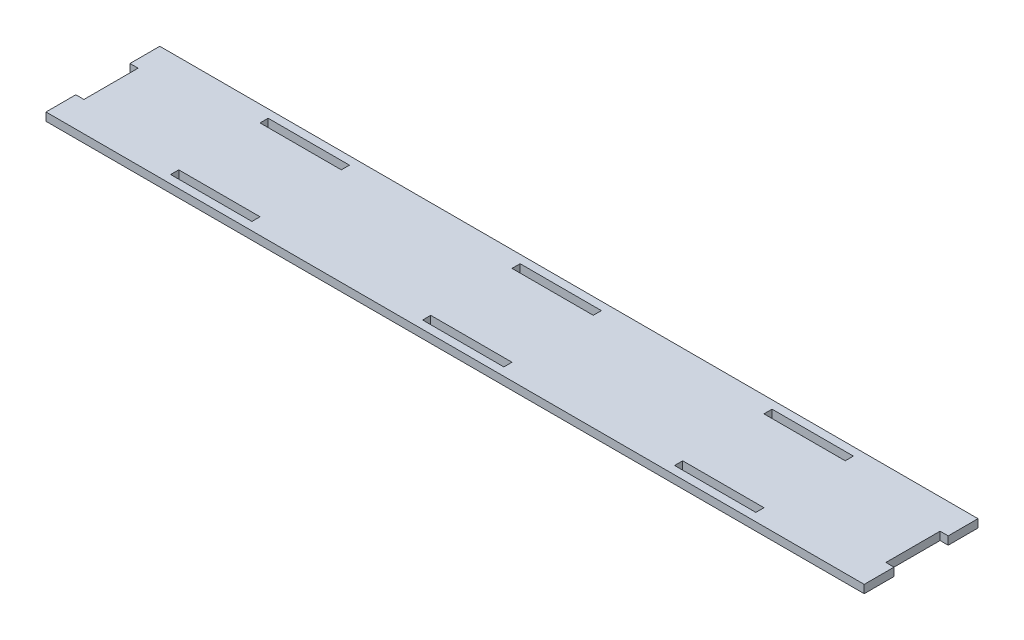
ISO-10303-21;
HEADER;
FILE_DESCRIPTION(('STEP AP214'),'2;1');
FILE_NAME('part.step','',(''),(''),'','','');
FILE_SCHEMA(('AUTOMOTIVE_DESIGN { 1 0 10303 214 1 1 1 1 }'));
ENDSEC;
DATA;
#1=APPLICATION_CONTEXT('core data for automotive mechanical design processes');
#2=APPLICATION_PROTOCOL_DEFINITION('international standard','automotive_design',2000,#1);
#3=PRODUCT_CONTEXT('',#1,'mechanical');
#4=PRODUCT('Part','Part','',(#3));
#5=PRODUCT_RELATED_PRODUCT_CATEGORY('part','',(#4));
#6=PRODUCT_DEFINITION_FORMATION('','',#4);
#7=PRODUCT_DEFINITION_CONTEXT('part definition',#1,'design');
#8=PRODUCT_DEFINITION('design','',#6,#7);
#9=PRODUCT_DEFINITION_SHAPE('','',#8);
#10=(LENGTH_UNIT() NAMED_UNIT(*) SI_UNIT(.MILLI.,.METRE.));
#11=(NAMED_UNIT(*) PLANE_ANGLE_UNIT() SI_UNIT($,.RADIAN.));
#12=(NAMED_UNIT(*) SI_UNIT($,.STERADIAN.) SOLID_ANGLE_UNIT());
#13=UNCERTAINTY_MEASURE_WITH_UNIT(LENGTH_MEASURE(1.E-05),#10,'distance_accuracy_value','');
#14=(GEOMETRIC_REPRESENTATION_CONTEXT(3) GLOBAL_UNCERTAINTY_ASSIGNED_CONTEXT((#13)) GLOBAL_UNIT_ASSIGNED_CONTEXT((#10,
#11,#12)) REPRESENTATION_CONTEXT('',''));
#15=CARTESIAN_POINT('',(0.,0.,0.));
#16=DIRECTION('',(0.,0.,1.));
#17=DIRECTION('',(1.,0.,0.));
#18=AXIS2_PLACEMENT_3D('',#15,#16,#17);
#19=CARTESIAN_POINT('',(0.,3.,0.));
#20=DIRECTION('',(0.,-1.,0.));
#21=DIRECTION('',(0.,0.,-1.));
#22=AXIS2_PLACEMENT_3D('',#19,#20,#21);
#23=PLANE('',#22);
#24=DIRECTION('',(1.,0.,0.));
#25=VECTOR('',#24,1.);
#26=CARTESIAN_POINT('',(136.,3.,-3.00000000000007));
#27=LINE('',#26,#25);
#28=CARTESIAN_POINT('',(136.,3.,-3.00000000000007));
#29=VERTEX_POINT('',#28);
#30=CARTESIAN_POINT('',(166.,3.,-3.00000000000007));
#31=VERTEX_POINT('',#30);
#32=EDGE_CURVE('E302',#29,#31,#27,.T.);
#33=ORIENTED_EDGE('',*,*,#32,.F.);
#34=DIRECTION('',(0.,0.,1.));
#35=VECTOR('',#34,1.);
#36=CARTESIAN_POINT('',(136.,3.,-3.00000000000007));
#37=LINE('',#36,#35);
#38=CARTESIAN_POINT('',(136.,3.,-6.00000000000007));
#39=VERTEX_POINT('',#38);
#40=EDGE_CURVE('E310',#39,#29,#37,.T.);
#41=ORIENTED_EDGE('',*,*,#40,.F.);
#42=DIRECTION('',(-1.,0.,0.));
#43=VECTOR('',#42,1.);
#44=CARTESIAN_POINT('',(136.,3.,-6.00000000000007));
#45=LINE('',#44,#43);
#46=CARTESIAN_POINT('',(166.,3.,-6.00000000000007));
#47=VERTEX_POINT('',#46);
#48=EDGE_CURVE('E307',#47,#39,#45,.T.);
#49=ORIENTED_EDGE('',*,*,#48,.F.);
#50=DIRECTION('',(0.,0.,-1.));
#51=VECTOR('',#50,1.);
#52=CARTESIAN_POINT('',(166.,3.,-3.00000000000007));
#53=LINE('',#52,#51);
#54=EDGE_CURVE('E304',#31,#47,#53,.T.);
#55=ORIENTED_EDGE('',*,*,#54,.F.);
#56=EDGE_LOOP('',(#33,#41,#49,#55));
#57=FACE_BOUND('',#56,.T.);
#58=DIRECTION('',(0.,0.,1.));
#59=VECTOR('',#58,1.);
#60=CARTESIAN_POINT('',(229.,3.,-39.));
#61=LINE('',#60,#59);
#62=CARTESIAN_POINT('',(229.,3.,-39.));
#63=VERTEX_POINT('',#62);
#64=CARTESIAN_POINT('',(229.,3.,-35.9972315914517));
#65=VERTEX_POINT('',#64);
#66=EDGE_CURVE('E364',#63,#65,#61,.T.);
#67=ORIENTED_EDGE('',*,*,#66,.F.);
#68=DIRECTION('',(-1.,0.,0.));
#69=VECTOR('',#68,1.);
#70=CARTESIAN_POINT('',(229.,3.,-39.));
#71=LINE('',#70,#69);
#72=CARTESIAN_POINT('',(259.,3.,-39.));
#73=VERTEX_POINT('',#72);
#74=EDGE_CURVE('E372',#73,#63,#71,.T.);
#75=ORIENTED_EDGE('',*,*,#74,.F.);
#76=DIRECTION('',(0.,0.,-1.));
#77=VECTOR('',#76,1.);
#78=CARTESIAN_POINT('',(259.,3.,-39.));
#79=LINE('',#78,#77);
#80=CARTESIAN_POINT('',(259.,3.,-35.9972315914517));
#81=VERTEX_POINT('',#80);
#82=EDGE_CURVE('E369',#81,#73,#79,.T.);
#83=ORIENTED_EDGE('',*,*,#82,.F.);
#84=DIRECTION('',(1.,0.,0.));
#85=VECTOR('',#84,1.);
#86=CARTESIAN_POINT('',(229.,3.,-35.9972315914517));
#87=LINE('',#86,#85);
#88=EDGE_CURVE('E366',#65,#81,#87,.T.);
#89=ORIENTED_EDGE('',*,*,#88,.F.);
#90=EDGE_LOOP('',(#67,#75,#83,#89));
#91=FACE_BOUND('',#90,.T.);
#92=DIRECTION('',(0.,0.,1.));
#93=VECTOR('',#92,1.);
#94=CARTESIAN_POINT('',(43.,3.,-38.9972315914518));
#95=LINE('',#94,#93);
#96=CARTESIAN_POINT('',(43.,3.,-38.9972315914518));
#97=VERTEX_POINT('',#96);
#98=CARTESIAN_POINT('',(43.,3.,-35.9972315914518));
#99=VERTEX_POINT('',#98);
#100=EDGE_CURVE('E426',#97,#99,#95,.T.);
#101=ORIENTED_EDGE('',*,*,#100,.F.);
#102=DIRECTION('',(-1.,0.,0.));
#103=VECTOR('',#102,1.);
#104=CARTESIAN_POINT('',(43.,3.,-38.9972315914518));
#105=LINE('',#104,#103);
#106=CARTESIAN_POINT('',(73.,3.,-38.9972315914518));
#107=VERTEX_POINT('',#106);
#108=EDGE_CURVE('E434',#107,#97,#105,.T.);
#109=ORIENTED_EDGE('',*,*,#108,.F.);
#110=DIRECTION('',(0.,0.,-1.));
#111=VECTOR('',#110,1.);
#112=CARTESIAN_POINT('',(73.,3.,-38.9972315914518));
#113=LINE('',#112,#111);
#114=CARTESIAN_POINT('',(73.,3.,-35.9972315914518));
#115=VERTEX_POINT('',#114);
#116=EDGE_CURVE('E431',#115,#107,#113,.T.);
#117=ORIENTED_EDGE('',*,*,#116,.F.);
#118=DIRECTION('',(1.,0.,0.));
#119=VECTOR('',#118,1.);
#120=CARTESIAN_POINT('',(43.,3.,-35.9972315914518));
#121=LINE('',#120,#119);
#122=EDGE_CURVE('E428',#99,#115,#121,.T.);
#123=ORIENTED_EDGE('',*,*,#122,.F.);
#124=EDGE_LOOP('',(#101,#109,#117,#123));
#125=FACE_BOUND('',#124,.T.);
#126=DIRECTION('',(0.,0.,1.));
#127=VECTOR('',#126,1.);
#128=CARTESIAN_POINT('',(0.,3.,0.));
#129=LINE('',#128,#127);
#130=CARTESIAN_POINT('',(0.,3.,-11.));
#131=VERTEX_POINT('',#130);
#132=CARTESIAN_POINT('',(0.,3.,0.));
#133=VERTEX_POINT('',#132);
#134=EDGE_CURVE('E457',#131,#133,#129,.T.);
#135=ORIENTED_EDGE('',*,*,#134,.T.);
#136=DIRECTION('',(1.,0.,0.));
#137=VECTOR('',#136,1.);
#138=CARTESIAN_POINT('',(0.,3.,0.));
#139=LINE('',#138,#137);
#140=CARTESIAN_POINT('',(302.,3.,0.));
#141=VERTEX_POINT('',#140);
#142=EDGE_CURVE('E460',#133,#141,#139,.T.);
#143=ORIENTED_EDGE('',*,*,#142,.T.);
#144=DIRECTION('',(0.,0.,-1.));
#145=VECTOR('',#144,1.);
#146=CARTESIAN_POINT('',(302.,3.,0.));
#147=LINE('',#146,#145);
#148=CARTESIAN_POINT('',(302.,3.,-11.));
#149=VERTEX_POINT('',#148);
#150=EDGE_CURVE('E463',#141,#149,#147,.T.);
#151=ORIENTED_EDGE('',*,*,#150,.T.);
#152=DIRECTION('',(-1.,0.,0.));
#153=VECTOR('',#152,1.);
#154=CARTESIAN_POINT('',(302.,3.,-11.));
#155=LINE('',#154,#153);
#156=CARTESIAN_POINT('',(299.,3.,-11.));
#157=VERTEX_POINT('',#156);
#158=EDGE_CURVE('E465',#149,#157,#155,.T.);
#159=ORIENTED_EDGE('',*,*,#158,.T.);
#160=DIRECTION('',(0.,0.,-1.));
#161=VECTOR('',#160,1.);
#162=CARTESIAN_POINT('',(299.,3.,-31.));
#163=LINE('',#162,#161);
#164=CARTESIAN_POINT('',(299.,3.,-31.));
#165=VERTEX_POINT('',#164);
#166=EDGE_CURVE('E467',#157,#165,#163,.T.);
#167=ORIENTED_EDGE('',*,*,#166,.T.);
#168=DIRECTION('',(1.,0.,0.));
#169=VECTOR('',#168,1.);
#170=CARTESIAN_POINT('',(302.,3.,-31.));
#171=LINE('',#170,#169);
#172=CARTESIAN_POINT('',(302.,3.,-31.));
#173=VERTEX_POINT('',#172);
#174=EDGE_CURVE('E469',#165,#173,#171,.T.);
#175=ORIENTED_EDGE('',*,*,#174,.T.);
#176=DIRECTION('',(0.,0.,-1.));
#177=VECTOR('',#176,1.);
#178=CARTESIAN_POINT('',(302.,3.,-31.));
#179=LINE('',#178,#177);
#180=CARTESIAN_POINT('',(302.,3.,-42.));
#181=VERTEX_POINT('',#180);
#182=EDGE_CURVE('E471',#173,#181,#179,.T.);
#183=ORIENTED_EDGE('',*,*,#182,.T.);
#184=DIRECTION('',(-1.,0.,0.));
#185=VECTOR('',#184,1.);
#186=CARTESIAN_POINT('',(0.,3.,-42.));
#187=LINE('',#186,#185);
#188=CARTESIAN_POINT('',(0.,3.,-42.));
#189=VERTEX_POINT('',#188);
#190=EDGE_CURVE('E473',#181,#189,#187,.T.);
#191=ORIENTED_EDGE('',*,*,#190,.T.);
#192=DIRECTION('',(0.,0.,1.));
#193=VECTOR('',#192,1.);
#194=CARTESIAN_POINT('',(0.,3.,-31.));
#195=LINE('',#194,#193);
#196=CARTESIAN_POINT('',(0.,3.,-31.));
#197=VERTEX_POINT('',#196);
#198=EDGE_CURVE('E475',#189,#197,#195,.T.);
#199=ORIENTED_EDGE('',*,*,#198,.T.);
#200=DIRECTION('',(1.,0.,0.));
#201=VECTOR('',#200,1.);
#202=CARTESIAN_POINT('',(0.,3.,-31.));
#203=LINE('',#202,#201);
#204=CARTESIAN_POINT('',(3.,3.,-31.));
#205=VERTEX_POINT('',#204);
#206=EDGE_CURVE('E477',#197,#205,#203,.T.);
#207=ORIENTED_EDGE('',*,*,#206,.T.);
#208=DIRECTION('',(0.,0.,1.));
#209=VECTOR('',#208,1.);
#210=CARTESIAN_POINT('',(3.,3.,-31.));
#211=LINE('',#210,#209);
#212=CARTESIAN_POINT('',(3.,3.,-11.));
#213=VERTEX_POINT('',#212);
#214=EDGE_CURVE('E479',#205,#213,#211,.T.);
#215=ORIENTED_EDGE('',*,*,#214,.T.);
#216=DIRECTION('',(-1.,0.,0.));
#217=VECTOR('',#216,1.);
#218=CARTESIAN_POINT('',(0.,3.,-11.));
#219=LINE('',#218,#217);
#220=EDGE_CURVE('E481',#213,#131,#219,.T.);
#221=ORIENTED_EDGE('',*,*,#220,.T.);
#222=EDGE_LOOP('',(#135,#143,#151,#159,#167,#175,#183,#191,#199,#207,#215,#221));
#223=FACE_BOUND('',#222,.T.);
#224=DIRECTION('',(0.,0.,1.));
#225=VECTOR('',#224,1.);
#226=CARTESIAN_POINT('',(136.,3.,-39.));
#227=LINE('',#226,#225);
#228=CARTESIAN_POINT('',(136.,3.,-39.));
#229=VERTEX_POINT('',#228);
#230=CARTESIAN_POINT('',(136.,3.,-36.));
#231=VERTEX_POINT('',#230);
#232=EDGE_CURVE('E395',#229,#231,#227,.T.);
#233=ORIENTED_EDGE('',*,*,#232,.F.);
#234=DIRECTION('',(-1.,0.,0.));
#235=VECTOR('',#234,1.);
#236=CARTESIAN_POINT('',(136.,3.,-39.));
#237=LINE('',#236,#235);
#238=CARTESIAN_POINT('',(166.,3.,-39.));
#239=VERTEX_POINT('',#238);
#240=EDGE_CURVE('E403',#239,#229,#237,.T.);
#241=ORIENTED_EDGE('',*,*,#240,.F.);
#242=DIRECTION('',(0.,0.,-1.));
#243=VECTOR('',#242,1.);
#244=CARTESIAN_POINT('',(166.,3.,-39.));
#245=LINE('',#244,#243);
#246=CARTESIAN_POINT('',(166.,3.,-36.));
#247=VERTEX_POINT('',#246);
#248=EDGE_CURVE('E400',#247,#239,#245,.T.);
#249=ORIENTED_EDGE('',*,*,#248,.F.);
#250=DIRECTION('',(1.,0.,0.));
#251=VECTOR('',#250,1.);
#252=CARTESIAN_POINT('',(136.,3.,-36.));
#253=LINE('',#252,#251);
#254=EDGE_CURVE('E397',#231,#247,#253,.T.);
#255=ORIENTED_EDGE('',*,*,#254,.F.);
#256=EDGE_LOOP('',(#233,#241,#249,#255));
#257=FACE_BOUND('',#256,.T.);
#258=DIRECTION('',(1.,0.,0.));
#259=VECTOR('',#258,1.);
#260=CARTESIAN_POINT('',(229.,3.,-3.00000000000007));
#261=LINE('',#260,#259);
#262=CARTESIAN_POINT('',(229.,3.,-3.00000000000007));
#263=VERTEX_POINT('',#262);
#264=CARTESIAN_POINT('',(259.,3.,-3.00000000000007));
#265=VERTEX_POINT('',#264);
#266=EDGE_CURVE('E333',#263,#265,#261,.T.);
#267=ORIENTED_EDGE('',*,*,#266,.F.);
#268=DIRECTION('',(0.,0.,1.));
#269=VECTOR('',#268,1.);
#270=CARTESIAN_POINT('',(229.,3.,-3.00000000000007));
#271=LINE('',#270,#269);
#272=CARTESIAN_POINT('',(229.,3.,-6.00276840854835));
#273=VERTEX_POINT('',#272);
#274=EDGE_CURVE('E341',#273,#263,#271,.T.);
#275=ORIENTED_EDGE('',*,*,#274,.F.);
#276=DIRECTION('',(-1.,0.,0.));
#277=VECTOR('',#276,1.);
#278=CARTESIAN_POINT('',(229.,3.,-6.00276840854835));
#279=LINE('',#278,#277);
#280=CARTESIAN_POINT('',(259.,3.,-6.00276840854835));
#281=VERTEX_POINT('',#280);
#282=EDGE_CURVE('E338',#281,#273,#279,.T.);
#283=ORIENTED_EDGE('',*,*,#282,.F.);
#284=DIRECTION('',(0.,0.,-1.));
#285=VECTOR('',#284,1.);
#286=CARTESIAN_POINT('',(259.,3.,-3.00000000000007));
#287=LINE('',#286,#285);
#288=EDGE_CURVE('E335',#265,#281,#287,.T.);
#289=ORIENTED_EDGE('',*,*,#288,.F.);
#290=EDGE_LOOP('',(#267,#275,#283,#289));
#291=FACE_BOUND('',#290,.T.);
#292=DIRECTION('',(1.,0.,0.));
#293=VECTOR('',#292,1.);
#294=CARTESIAN_POINT('',(43.,3.,-3.00276840854827));
#295=LINE('',#294,#293);
#296=CARTESIAN_POINT('',(43.,3.,-3.00276840854827));
#297=VERTEX_POINT('',#296);
#298=CARTESIAN_POINT('',(73.,3.,-3.00276840854827));
#299=VERTEX_POINT('',#298);
#300=EDGE_CURVE('E266',#297,#299,#295,.T.);
#301=ORIENTED_EDGE('',*,*,#300,.F.);
#302=DIRECTION('',(0.,0.,1.));
#303=VECTOR('',#302,1.);
#304=CARTESIAN_POINT('',(43.,3.,-3.00276840854827));
#305=LINE('',#304,#303);
#306=CARTESIAN_POINT('',(43.,3.,-6.00276840854827));
#307=VERTEX_POINT('',#306);
#308=EDGE_CURVE('E288',#307,#297,#305,.T.);
#309=ORIENTED_EDGE('',*,*,#308,.F.);
#310=DIRECTION('',(-1.,0.,0.));
#311=VECTOR('',#310,1.);
#312=CARTESIAN_POINT('',(43.,3.,-6.00276840854827));
#313=LINE('',#312,#311);
#314=CARTESIAN_POINT('',(73.,3.,-6.00276840854827));
#315=VERTEX_POINT('',#314);
#316=EDGE_CURVE('E286',#315,#307,#313,.T.);
#317=ORIENTED_EDGE('',*,*,#316,.F.);
#318=DIRECTION('',(0.,0.,-1.));
#319=VECTOR('',#318,1.);
#320=CARTESIAN_POINT('',(73.,3.,-3.00276840854827));
#321=LINE('',#320,#319);
#322=EDGE_CURVE('E274',#299,#315,#321,.T.);
#323=ORIENTED_EDGE('',*,*,#322,.F.);
#324=EDGE_LOOP('',(#301,#309,#317,#323));
#325=FACE_BOUND('',#324,.T.);
#326=ADVANCED_FACE('F33',(#57,#91,#125,#223,#257,#291,#325),#23,.F.);
#327=CARTESIAN_POINT('',(0.,0.,0.));
#328=DIRECTION('',(0.,-1.,0.));
#329=DIRECTION('',(0.,0.,-1.));
#330=AXIS2_PLACEMENT_3D('',#327,#328,#329);
#331=PLANE('',#330);
#332=DIRECTION('',(0.,0.,1.));
#333=VECTOR('',#332,1.);
#334=CARTESIAN_POINT('',(0.,0.,0.));
#335=LINE('',#334,#333);
#336=CARTESIAN_POINT('',(0.,0.,-11.));
#337=VERTEX_POINT('',#336);
#338=CARTESIAN_POINT('',(0.,0.,0.));
#339=VERTEX_POINT('',#338);
#340=EDGE_CURVE('E456',#337,#339,#335,.T.);
#341=ORIENTED_EDGE('',*,*,#340,.F.);
#342=DIRECTION('',(-1.,0.,0.));
#343=VECTOR('',#342,1.);
#344=CARTESIAN_POINT('',(0.,0.,-11.));
#345=LINE('',#344,#343);
#346=CARTESIAN_POINT('',(3.,0.,-11.));
#347=VERTEX_POINT('',#346);
#348=EDGE_CURVE('E461',#347,#337,#345,.T.);
#349=ORIENTED_EDGE('',*,*,#348,.F.);
#350=DIRECTION('',(0.,0.,1.));
#351=VECTOR('',#350,1.);
#352=CARTESIAN_POINT('',(3.,0.,-31.));
#353=LINE('',#352,#351);
#354=CARTESIAN_POINT('',(3.,0.,-31.));
#355=VERTEX_POINT('',#354);
#356=EDGE_CURVE('E504',#355,#347,#353,.T.);
#357=ORIENTED_EDGE('',*,*,#356,.F.);
#358=DIRECTION('',(1.,0.,0.));
#359=VECTOR('',#358,1.);
#360=CARTESIAN_POINT('',(0.,0.,-31.));
#361=LINE('',#360,#359);
#362=CARTESIAN_POINT('',(0.,0.,-31.));
#363=VERTEX_POINT('',#362);
#364=EDGE_CURVE('E502',#363,#355,#361,.T.);
#365=ORIENTED_EDGE('',*,*,#364,.F.);
#366=DIRECTION('',(0.,0.,1.));
#367=VECTOR('',#366,1.);
#368=CARTESIAN_POINT('',(0.,0.,-31.));
#369=LINE('',#368,#367);
#370=CARTESIAN_POINT('',(0.,0.,-42.));
#371=VERTEX_POINT('',#370);
#372=EDGE_CURVE('E500',#371,#363,#369,.T.);
#373=ORIENTED_EDGE('',*,*,#372,.F.);
#374=DIRECTION('',(-1.,0.,0.));
#375=VECTOR('',#374,1.);
#376=CARTESIAN_POINT('',(0.,0.,-42.));
#377=LINE('',#376,#375);
#378=CARTESIAN_POINT('',(302.,0.,-42.));
#379=VERTEX_POINT('',#378);
#380=EDGE_CURVE('E498',#379,#371,#377,.T.);
#381=ORIENTED_EDGE('',*,*,#380,.F.);
#382=DIRECTION('',(0.,0.,-1.));
#383=VECTOR('',#382,1.);
#384=CARTESIAN_POINT('',(302.,0.,-31.));
#385=LINE('',#384,#383);
#386=CARTESIAN_POINT('',(302.,0.,-31.));
#387=VERTEX_POINT('',#386);
#388=EDGE_CURVE('E496',#387,#379,#385,.T.);
#389=ORIENTED_EDGE('',*,*,#388,.F.);
#390=DIRECTION('',(1.,0.,0.));
#391=VECTOR('',#390,1.);
#392=CARTESIAN_POINT('',(302.,0.,-31.));
#393=LINE('',#392,#391);
#394=CARTESIAN_POINT('',(299.,0.,-31.));
#395=VERTEX_POINT('',#394);
#396=EDGE_CURVE('E494',#395,#387,#393,.T.);
#397=ORIENTED_EDGE('',*,*,#396,.F.);
#398=DIRECTION('',(0.,0.,-1.));
#399=VECTOR('',#398,1.);
#400=CARTESIAN_POINT('',(299.,0.,-31.));
#401=LINE('',#400,#399);
#402=CARTESIAN_POINT('',(299.,0.,-11.));
#403=VERTEX_POINT('',#402);
#404=EDGE_CURVE('E492',#403,#395,#401,.T.);
#405=ORIENTED_EDGE('',*,*,#404,.F.);
#406=DIRECTION('',(-1.,0.,0.));
#407=VECTOR('',#406,1.);
#408=CARTESIAN_POINT('',(302.,0.,-11.));
#409=LINE('',#408,#407);
#410=CARTESIAN_POINT('',(302.,0.,-11.));
#411=VERTEX_POINT('',#410);
#412=EDGE_CURVE('E490',#411,#403,#409,.T.);
#413=ORIENTED_EDGE('',*,*,#412,.F.);
#414=DIRECTION('',(0.,0.,-1.));
#415=VECTOR('',#414,1.);
#416=CARTESIAN_POINT('',(302.,0.,0.));
#417=LINE('',#416,#415);
#418=CARTESIAN_POINT('',(302.,0.,0.));
#419=VERTEX_POINT('',#418);
#420=EDGE_CURVE('E488',#419,#411,#417,.T.);
#421=ORIENTED_EDGE('',*,*,#420,.F.);
#422=DIRECTION('',(1.,0.,0.));
#423=VECTOR('',#422,1.);
#424=CARTESIAN_POINT('',(0.,0.,0.));
#425=LINE('',#424,#423);
#426=EDGE_CURVE('E486',#339,#419,#425,.T.);
#427=ORIENTED_EDGE('',*,*,#426,.F.);
#428=EDGE_LOOP('',(#341,#349,#357,#365,#373,#381,#389,#397,#405,#413,#421,#427));
#429=FACE_BOUND('',#428,.T.);
#430=DIRECTION('',(-1.,0.,0.));
#431=VECTOR('',#430,1.);
#432=CARTESIAN_POINT('',(43.,0.,-38.9972315914518));
#433=LINE('',#432,#431);
#434=CARTESIAN_POINT('',(73.,0.,-38.9972315914518));
#435=VERTEX_POINT('',#434);
#436=CARTESIAN_POINT('',(43.,0.,-38.9972315914518));
#437=VERTEX_POINT('',#436);
#438=EDGE_CURVE('E429',#435,#437,#433,.T.);
#439=ORIENTED_EDGE('',*,*,#438,.T.);
#440=DIRECTION('',(0.,0.,1.));
#441=VECTOR('',#440,1.);
#442=CARTESIAN_POINT('',(43.,0.,-38.9972315914518));
#443=LINE('',#442,#441);
#444=CARTESIAN_POINT('',(43.,0.,-35.9972315914518));
#445=VERTEX_POINT('',#444);
#446=EDGE_CURVE('E425',#437,#445,#443,.T.);
#447=ORIENTED_EDGE('',*,*,#446,.T.);
#448=DIRECTION('',(1.,0.,0.));
#449=VECTOR('',#448,1.);
#450=CARTESIAN_POINT('',(43.,0.,-35.9972315914518));
#451=LINE('',#450,#449);
#452=CARTESIAN_POINT('',(73.,0.,-35.9972315914518));
#453=VERTEX_POINT('',#452);
#454=EDGE_CURVE('E439',#445,#453,#451,.T.);
#455=ORIENTED_EDGE('',*,*,#454,.T.);
#456=DIRECTION('',(0.,0.,-1.));
#457=VECTOR('',#456,1.);
#458=CARTESIAN_POINT('',(73.,0.,-38.9972315914518));
#459=LINE('',#458,#457);
#460=EDGE_CURVE('E442',#453,#435,#459,.T.);
#461=ORIENTED_EDGE('',*,*,#460,.T.);
#462=EDGE_LOOP('',(#439,#447,#455,#461));
#463=FACE_BOUND('',#462,.T.);
#464=DIRECTION('',(-1.,0.,0.));
#465=VECTOR('',#464,1.);
#466=CARTESIAN_POINT('',(136.,0.,-39.));
#467=LINE('',#466,#465);
#468=CARTESIAN_POINT('',(166.,0.,-39.));
#469=VERTEX_POINT('',#468);
#470=CARTESIAN_POINT('',(136.,0.,-39.));
#471=VERTEX_POINT('',#470);
#472=EDGE_CURVE('E398',#469,#471,#467,.T.);
#473=ORIENTED_EDGE('',*,*,#472,.T.);
#474=DIRECTION('',(0.,0.,1.));
#475=VECTOR('',#474,1.);
#476=CARTESIAN_POINT('',(136.,0.,-39.));
#477=LINE('',#476,#475);
#478=CARTESIAN_POINT('',(136.,0.,-36.));
#479=VERTEX_POINT('',#478);
#480=EDGE_CURVE('E394',#471,#479,#477,.T.);
#481=ORIENTED_EDGE('',*,*,#480,.T.);
#482=DIRECTION('',(1.,0.,0.));
#483=VECTOR('',#482,1.);
#484=CARTESIAN_POINT('',(136.,0.,-36.));
#485=LINE('',#484,#483);
#486=CARTESIAN_POINT('',(166.,0.,-36.));
#487=VERTEX_POINT('',#486);
#488=EDGE_CURVE('E408',#479,#487,#485,.T.);
#489=ORIENTED_EDGE('',*,*,#488,.T.);
#490=DIRECTION('',(0.,0.,-1.));
#491=VECTOR('',#490,1.);
#492=CARTESIAN_POINT('',(166.,0.,-39.));
#493=LINE('',#492,#491);
#494=EDGE_CURVE('E411',#487,#469,#493,.T.);
#495=ORIENTED_EDGE('',*,*,#494,.T.);
#496=EDGE_LOOP('',(#473,#481,#489,#495));
#497=FACE_BOUND('',#496,.T.);
#498=DIRECTION('',(-1.,0.,0.));
#499=VECTOR('',#498,1.);
#500=CARTESIAN_POINT('',(229.,0.,-39.));
#501=LINE('',#500,#499);
#502=CARTESIAN_POINT('',(259.,0.,-39.));
#503=VERTEX_POINT('',#502);
#504=CARTESIAN_POINT('',(229.,0.,-39.));
#505=VERTEX_POINT('',#504);
#506=EDGE_CURVE('E367',#503,#505,#501,.T.);
#507=ORIENTED_EDGE('',*,*,#506,.T.);
#508=DIRECTION('',(0.,0.,1.));
#509=VECTOR('',#508,1.);
#510=CARTESIAN_POINT('',(229.,0.,-39.));
#511=LINE('',#510,#509);
#512=CARTESIAN_POINT('',(229.,0.,-35.9972315914517));
#513=VERTEX_POINT('',#512);
#514=EDGE_CURVE('E363',#505,#513,#511,.T.);
#515=ORIENTED_EDGE('',*,*,#514,.T.);
#516=DIRECTION('',(1.,0.,0.));
#517=VECTOR('',#516,1.);
#518=CARTESIAN_POINT('',(229.,0.,-35.9972315914517));
#519=LINE('',#518,#517);
#520=CARTESIAN_POINT('',(259.,0.,-35.9972315914517));
#521=VERTEX_POINT('',#520);
#522=EDGE_CURVE('E377',#513,#521,#519,.T.);
#523=ORIENTED_EDGE('',*,*,#522,.T.);
#524=DIRECTION('',(0.,0.,-1.));
#525=VECTOR('',#524,1.);
#526=CARTESIAN_POINT('',(259.,0.,-39.));
#527=LINE('',#526,#525);
#528=EDGE_CURVE('E380',#521,#503,#527,.T.);
#529=ORIENTED_EDGE('',*,*,#528,.T.);
#530=EDGE_LOOP('',(#507,#515,#523,#529));
#531=FACE_BOUND('',#530,.T.);
#532=DIRECTION('',(0.,0.,1.));
#533=VECTOR('',#532,1.);
#534=CARTESIAN_POINT('',(229.,0.,-3.00000000000007));
#535=LINE('',#534,#533);
#536=CARTESIAN_POINT('',(229.,0.,-6.00276840854835));
#537=VERTEX_POINT('',#536);
#538=CARTESIAN_POINT('',(229.,0.,-3.00000000000007));
#539=VERTEX_POINT('',#538);
#540=EDGE_CURVE('E336',#537,#539,#535,.T.);
#541=ORIENTED_EDGE('',*,*,#540,.T.);
#542=DIRECTION('',(1.,0.,0.));
#543=VECTOR('',#542,1.);
#544=CARTESIAN_POINT('',(229.,0.,-3.00000000000007));
#545=LINE('',#544,#543);
#546=CARTESIAN_POINT('',(259.,0.,-3.00000000000007));
#547=VERTEX_POINT('',#546);
#548=EDGE_CURVE('E332',#539,#547,#545,.T.);
#549=ORIENTED_EDGE('',*,*,#548,.T.);
#550=DIRECTION('',(0.,0.,-1.));
#551=VECTOR('',#550,1.);
#552=CARTESIAN_POINT('',(259.,0.,-3.00000000000007));
#553=LINE('',#552,#551);
#554=CARTESIAN_POINT('',(259.,0.,-6.00276840854835));
#555=VERTEX_POINT('',#554);
#556=EDGE_CURVE('E346',#547,#555,#553,.T.);
#557=ORIENTED_EDGE('',*,*,#556,.T.);
#558=DIRECTION('',(-1.,0.,0.));
#559=VECTOR('',#558,1.);
#560=CARTESIAN_POINT('',(229.,0.,-6.00276840854835));
#561=LINE('',#560,#559);
#562=EDGE_CURVE('E349',#555,#537,#561,.T.);
#563=ORIENTED_EDGE('',*,*,#562,.T.);
#564=EDGE_LOOP('',(#541,#549,#557,#563));
#565=FACE_BOUND('',#564,.T.);
#566=DIRECTION('',(0.,0.,1.));
#567=VECTOR('',#566,1.);
#568=CARTESIAN_POINT('',(136.,0.,-3.00000000000007));
#569=LINE('',#568,#567);
#570=CARTESIAN_POINT('',(136.,0.,-6.00000000000007));
#571=VERTEX_POINT('',#570);
#572=CARTESIAN_POINT('',(136.,0.,-3.00000000000007));
#573=VERTEX_POINT('',#572);
#574=EDGE_CURVE('E305',#571,#573,#569,.T.);
#575=ORIENTED_EDGE('',*,*,#574,.T.);
#576=DIRECTION('',(1.,0.,0.));
#577=VECTOR('',#576,1.);
#578=CARTESIAN_POINT('',(136.,0.,-3.00000000000007));
#579=LINE('',#578,#577);
#580=CARTESIAN_POINT('',(166.,0.,-3.00000000000007));
#581=VERTEX_POINT('',#580);
#582=EDGE_CURVE('E282',#573,#581,#579,.T.);
#583=ORIENTED_EDGE('',*,*,#582,.T.);
#584=DIRECTION('',(0.,0.,-1.));
#585=VECTOR('',#584,1.);
#586=CARTESIAN_POINT('',(166.,0.,-3.00000000000007));
#587=LINE('',#586,#585);
#588=CARTESIAN_POINT('',(166.,0.,-6.00000000000007));
#589=VERTEX_POINT('',#588);
#590=EDGE_CURVE('E315',#581,#589,#587,.T.);
#591=ORIENTED_EDGE('',*,*,#590,.T.);
#592=DIRECTION('',(-1.,0.,0.));
#593=VECTOR('',#592,1.);
#594=CARTESIAN_POINT('',(136.,0.,-6.00000000000007));
#595=LINE('',#594,#593);
#596=EDGE_CURVE('E318',#589,#571,#595,.T.);
#597=ORIENTED_EDGE('',*,*,#596,.T.);
#598=EDGE_LOOP('',(#575,#583,#591,#597));
#599=FACE_BOUND('',#598,.T.);
#600=DIRECTION('',(0.,0.,1.));
#601=VECTOR('',#600,1.);
#602=CARTESIAN_POINT('',(43.,0.,-3.00276840854827));
#603=LINE('',#602,#601);
#604=CARTESIAN_POINT('',(43.,0.,-6.00276840854827));
#605=VERTEX_POINT('',#604);
#606=CARTESIAN_POINT('',(43.,0.,-3.00276840854827));
#607=VERTEX_POINT('',#606);
#608=EDGE_CURVE('E275',#605,#607,#603,.T.);
#609=ORIENTED_EDGE('',*,*,#608,.T.);
#610=DIRECTION('',(1.,0.,0.));
#611=VECTOR('',#610,1.);
#612=CARTESIAN_POINT('',(43.,0.,-3.00276840854827));
#613=LINE('',#612,#611);
#614=CARTESIAN_POINT('',(73.,0.,-3.00276840854827));
#615=VERTEX_POINT('',#614);
#616=EDGE_CURVE('E56',#607,#615,#613,.T.);
#617=ORIENTED_EDGE('',*,*,#616,.T.);
#618=DIRECTION('',(0.,0.,-1.));
#619=VECTOR('',#618,1.);
#620=CARTESIAN_POINT('',(73.,0.,-3.00276840854827));
#621=LINE('',#620,#619);
#622=CARTESIAN_POINT('',(73.,0.,-6.00276840854827));
#623=VERTEX_POINT('',#622);
#624=EDGE_CURVE('E281',#615,#623,#621,.T.);
#625=ORIENTED_EDGE('',*,*,#624,.T.);
#626=DIRECTION('',(-1.,0.,0.));
#627=VECTOR('',#626,1.);
#628=CARTESIAN_POINT('',(43.,0.,-6.00276840854827));
#629=LINE('',#628,#627);
#630=EDGE_CURVE('E294',#623,#605,#629,.T.);
#631=ORIENTED_EDGE('',*,*,#630,.T.);
#632=EDGE_LOOP('',(#609,#617,#625,#631));
#633=FACE_BOUND('',#632,.T.);
#634=ADVANCED_FACE('F546',(#429,#463,#497,#531,#565,#599,#633),#331,.T.);
#635=CARTESIAN_POINT('',(0.,3.,0.));
#636=DIRECTION('',(1.,0.,0.));
#637=DIRECTION('',(0.,0.,-1.));
#638=AXIS2_PLACEMENT_3D('',#635,#636,#637);
#639=PLANE('',#638);
#640=ORIENTED_EDGE('',*,*,#340,.T.);
#641=DIRECTION('',(0.,-1.,0.));
#642=VECTOR('',#641,1.);
#643=CARTESIAN_POINT('',(0.,3.,0.));
#644=LINE('',#643,#642);
#645=EDGE_CURVE('E11',#133,#339,#644,.T.);
#646=ORIENTED_EDGE('',*,*,#645,.F.);
#647=ORIENTED_EDGE('',*,*,#134,.F.);
#648=DIRECTION('',(0.,-1.,0.));
#649=VECTOR('',#648,1.);
#650=CARTESIAN_POINT('',(0.,3.,-11.));
#651=LINE('',#650,#649);
#652=EDGE_CURVE('E483',#131,#337,#651,.T.);
#653=ORIENTED_EDGE('',*,*,#652,.T.);
#654=EDGE_LOOP('',(#640,#646,#647,#653));
#655=FACE_BOUND('',#654,.T.);
#656=ADVANCED_FACE('F35',(#655),#639,.F.);
#657=CARTESIAN_POINT('',(0.,3.,0.));
#658=DIRECTION('',(0.,0.,-1.));
#659=DIRECTION('',(-1.,0.,0.));
#660=AXIS2_PLACEMENT_3D('',#657,#658,#659);
#661=PLANE('',#660);
#662=ORIENTED_EDGE('',*,*,#426,.T.);
#663=DIRECTION('',(0.,-1.,0.));
#664=VECTOR('',#663,1.);
#665=CARTESIAN_POINT('',(302.,3.,0.));
#666=LINE('',#665,#664);
#667=EDGE_CURVE('E41',#141,#419,#666,.T.);
#668=ORIENTED_EDGE('',*,*,#667,.F.);
#669=ORIENTED_EDGE('',*,*,#142,.F.);
#670=ORIENTED_EDGE('',*,*,#645,.T.);
#671=EDGE_LOOP('',(#662,#668,#669,#670));
#672=FACE_BOUND('',#671,.T.);
#673=ADVANCED_FACE('F564',(#672),#661,.F.);
#674=CARTESIAN_POINT('',(302.,3.,0.));
#675=DIRECTION('',(-1.,0.,0.));
#676=DIRECTION('',(0.,0.,1.));
#677=AXIS2_PLACEMENT_3D('',#674,#675,#676);
#678=PLANE('',#677);
#679=ORIENTED_EDGE('',*,*,#420,.T.);
#680=DIRECTION('',(0.,-1.,0.));
#681=VECTOR('',#680,1.);
#682=CARTESIAN_POINT('',(302.,3.,-11.));
#683=LINE('',#682,#681);
#684=EDGE_CURVE('E533',#149,#411,#683,.T.);
#685=ORIENTED_EDGE('',*,*,#684,.F.);
#686=ORIENTED_EDGE('',*,*,#150,.F.);
#687=ORIENTED_EDGE('',*,*,#667,.T.);
#688=EDGE_LOOP('',(#679,#685,#686,#687));
#689=FACE_BOUND('',#688,.T.);
#690=ADVANCED_FACE('F540',(#689),#678,.F.);
#691=CARTESIAN_POINT('',(302.,3.,-11.));
#692=DIRECTION('',(0.,0.,1.));
#693=DIRECTION('',(1.,0.,0.));
#694=AXIS2_PLACEMENT_3D('',#691,#692,#693);
#695=PLANE('',#694);
#696=ORIENTED_EDGE('',*,*,#412,.T.);
#697=DIRECTION('',(0.,-1.,0.));
#698=VECTOR('',#697,1.);
#699=CARTESIAN_POINT('',(299.,3.,-11.));
#700=LINE('',#699,#698);
#701=EDGE_CURVE('E530',#157,#403,#700,.T.);
#702=ORIENTED_EDGE('',*,*,#701,.F.);
#703=ORIENTED_EDGE('',*,*,#158,.F.);
#704=ORIENTED_EDGE('',*,*,#684,.T.);
#705=EDGE_LOOP('',(#696,#702,#703,#704));
#706=FACE_BOUND('',#705,.T.);
#707=ADVANCED_FACE('F552',(#706),#695,.F.);
#708=CARTESIAN_POINT('',(299.,3.,-31.));
#709=DIRECTION('',(-1.,0.,0.));
#710=DIRECTION('',(0.,0.,1.));
#711=AXIS2_PLACEMENT_3D('',#708,#709,#710);
#712=PLANE('',#711);
#713=ORIENTED_EDGE('',*,*,#404,.T.);
#714=DIRECTION('',(0.,-1.,0.));
#715=VECTOR('',#714,1.);
#716=CARTESIAN_POINT('',(299.,3.,-31.));
#717=LINE('',#716,#715);
#718=EDGE_CURVE('E527',#165,#395,#717,.T.);
#719=ORIENTED_EDGE('',*,*,#718,.F.);
#720=ORIENTED_EDGE('',*,*,#166,.F.);
#721=ORIENTED_EDGE('',*,*,#701,.T.);
#722=EDGE_LOOP('',(#713,#719,#720,#721));
#723=FACE_BOUND('',#722,.T.);
#724=ADVANCED_FACE('F556',(#723),#712,.F.);
#725=CARTESIAN_POINT('',(302.,3.,-31.));
#726=DIRECTION('',(0.,0.,-1.));
#727=DIRECTION('',(-1.,0.,0.));
#728=AXIS2_PLACEMENT_3D('',#725,#726,#727);
#729=PLANE('',#728);
#730=ORIENTED_EDGE('',*,*,#396,.T.);
#731=DIRECTION('',(0.,-1.,0.));
#732=VECTOR('',#731,1.);
#733=CARTESIAN_POINT('',(302.,3.,-31.));
#734=LINE('',#733,#732);
#735=EDGE_CURVE('E524',#173,#387,#734,.T.);
#736=ORIENTED_EDGE('',*,*,#735,.F.);
#737=ORIENTED_EDGE('',*,*,#174,.F.);
#738=ORIENTED_EDGE('',*,*,#718,.T.);
#739=EDGE_LOOP('',(#730,#736,#737,#738));
#740=FACE_BOUND('',#739,.T.);
#741=ADVANCED_FACE('F597',(#740),#729,.F.);
#742=CARTESIAN_POINT('',(302.,3.,-31.));
#743=DIRECTION('',(-1.,0.,0.));
#744=DIRECTION('',(0.,0.,1.));
#745=AXIS2_PLACEMENT_3D('',#742,#743,#744);
#746=PLANE('',#745);
#747=ORIENTED_EDGE('',*,*,#388,.T.);
#748=DIRECTION('',(0.,-1.,0.));
#749=VECTOR('',#748,1.);
#750=CARTESIAN_POINT('',(302.,3.,-42.));
#751=LINE('',#750,#749);
#752=EDGE_CURVE('E521',#181,#379,#751,.T.);
#753=ORIENTED_EDGE('',*,*,#752,.F.);
#754=ORIENTED_EDGE('',*,*,#182,.F.);
#755=ORIENTED_EDGE('',*,*,#735,.T.);
#756=EDGE_LOOP('',(#747,#753,#754,#755));
#757=FACE_BOUND('',#756,.T.);
#758=ADVANCED_FACE('F595',(#757),#746,.F.);
#759=CARTESIAN_POINT('',(0.,3.,-42.));
#760=DIRECTION('',(0.,0.,1.));
#761=DIRECTION('',(1.,0.,0.));
#762=AXIS2_PLACEMENT_3D('',#759,#760,#761);
#763=PLANE('',#762);
#764=ORIENTED_EDGE('',*,*,#380,.T.);
#765=DIRECTION('',(0.,-1.,0.));
#766=VECTOR('',#765,1.);
#767=CARTESIAN_POINT('',(0.,3.,-42.));
#768=LINE('',#767,#766);
#769=EDGE_CURVE('E518',#189,#371,#768,.T.);
#770=ORIENTED_EDGE('',*,*,#769,.F.);
#771=ORIENTED_EDGE('',*,*,#190,.F.);
#772=ORIENTED_EDGE('',*,*,#752,.T.);
#773=EDGE_LOOP('',(#764,#770,#771,#772));
#774=FACE_BOUND('',#773,.T.);
#775=ADVANCED_FACE('F591',(#774),#763,.F.);
#776=CARTESIAN_POINT('',(0.,3.,-31.));
#777=DIRECTION('',(1.,0.,0.));
#778=DIRECTION('',(0.,0.,-1.));
#779=AXIS2_PLACEMENT_3D('',#776,#777,#778);
#780=PLANE('',#779);
#781=ORIENTED_EDGE('',*,*,#372,.T.);
#782=DIRECTION('',(0.,-1.,0.));
#783=VECTOR('',#782,1.);
#784=CARTESIAN_POINT('',(0.,3.,-31.));
#785=LINE('',#784,#783);
#786=EDGE_CURVE('E515',#197,#363,#785,.T.);
#787=ORIENTED_EDGE('',*,*,#786,.F.);
#788=ORIENTED_EDGE('',*,*,#198,.F.);
#789=ORIENTED_EDGE('',*,*,#769,.T.);
#790=EDGE_LOOP('',(#781,#787,#788,#789));
#791=FACE_BOUND('',#790,.T.);
#792=ADVANCED_FACE('F586',(#791),#780,.F.);
#793=CARTESIAN_POINT('',(0.,3.,-31.));
#794=DIRECTION('',(0.,0.,-1.));
#795=DIRECTION('',(-1.,0.,0.));
#796=AXIS2_PLACEMENT_3D('',#793,#794,#795);
#797=PLANE('',#796);
#798=ORIENTED_EDGE('',*,*,#364,.T.);
#799=DIRECTION('',(0.,-1.,0.));
#800=VECTOR('',#799,1.);
#801=CARTESIAN_POINT('',(3.,3.,-31.));
#802=LINE('',#801,#800);
#803=EDGE_CURVE('E512',#205,#355,#802,.T.);
#804=ORIENTED_EDGE('',*,*,#803,.F.);
#805=ORIENTED_EDGE('',*,*,#206,.F.);
#806=ORIENTED_EDGE('',*,*,#786,.T.);
#807=EDGE_LOOP('',(#798,#804,#805,#806));
#808=FACE_BOUND('',#807,.T.);
#809=ADVANCED_FACE('F580',(#808),#797,.F.);
#810=CARTESIAN_POINT('',(3.,3.,-31.));
#811=DIRECTION('',(1.,0.,0.));
#812=DIRECTION('',(0.,0.,-1.));
#813=AXIS2_PLACEMENT_3D('',#810,#811,#812);
#814=PLANE('',#813);
#815=ORIENTED_EDGE('',*,*,#356,.T.);
#816=DIRECTION('',(0.,-1.,0.));
#817=VECTOR('',#816,1.);
#818=CARTESIAN_POINT('',(3.,3.,-11.));
#819=LINE('',#818,#817);
#820=EDGE_CURVE('E509',#213,#347,#819,.T.);
#821=ORIENTED_EDGE('',*,*,#820,.F.);
#822=ORIENTED_EDGE('',*,*,#214,.F.);
#823=ORIENTED_EDGE('',*,*,#803,.T.);
#824=EDGE_LOOP('',(#815,#821,#822,#823));
#825=FACE_BOUND('',#824,.T.);
#826=ADVANCED_FACE('F576',(#825),#814,.F.);
#827=CARTESIAN_POINT('',(0.,3.,-11.));
#828=DIRECTION('',(0.,0.,1.));
#829=DIRECTION('',(1.,0.,0.));
#830=AXIS2_PLACEMENT_3D('',#827,#828,#829);
#831=PLANE('',#830);
#832=ORIENTED_EDGE('',*,*,#348,.T.);
#833=ORIENTED_EDGE('',*,*,#652,.F.);
#834=ORIENTED_EDGE('',*,*,#220,.F.);
#835=ORIENTED_EDGE('',*,*,#820,.T.);
#836=EDGE_LOOP('',(#832,#833,#834,#835));
#837=FACE_BOUND('',#836,.T.);
#838=ADVANCED_FACE('F571',(#837),#831,.F.);
#839=CARTESIAN_POINT('',(43.,3.,-38.9972315914518));
#840=DIRECTION('',(1.,0.,0.));
#841=DIRECTION('',(0.,0.,-1.));
#842=AXIS2_PLACEMENT_3D('',#839,#840,#841);
#843=PLANE('',#842);
#844=ORIENTED_EDGE('',*,*,#446,.F.);
#845=DIRECTION('',(0.,-1.,0.));
#846=VECTOR('',#845,1.);
#847=CARTESIAN_POINT('',(43.,3.,-38.9972315914518));
#848=LINE('',#847,#846);
#849=EDGE_CURVE('E436',#97,#437,#848,.T.);
#850=ORIENTED_EDGE('',*,*,#849,.F.);
#851=ORIENTED_EDGE('',*,*,#100,.T.);
#852=DIRECTION('',(0.,-1.,0.));
#853=VECTOR('',#852,1.);
#854=CARTESIAN_POINT('',(43.,3.,-35.9972315914518));
#855=LINE('',#854,#853);
#856=EDGE_CURVE('E453',#99,#445,#855,.T.);
#857=ORIENTED_EDGE('',*,*,#856,.T.);
#858=EDGE_LOOP('',(#844,#850,#851,#857));
#859=FACE_BOUND('',#858,.T.);
#860=ADVANCED_FACE('F616',(#859),#843,.T.);
#861=CARTESIAN_POINT('',(43.,3.,-35.9972315914518));
#862=DIRECTION('',(0.,0.,-1.));
#863=DIRECTION('',(-1.,0.,0.));
#864=AXIS2_PLACEMENT_3D('',#861,#862,#863);
#865=PLANE('',#864);
#866=ORIENTED_EDGE('',*,*,#454,.F.);
#867=ORIENTED_EDGE('',*,*,#856,.F.);
#868=ORIENTED_EDGE('',*,*,#122,.T.);
#869=DIRECTION('',(0.,-1.,0.));
#870=VECTOR('',#869,1.);
#871=CARTESIAN_POINT('',(73.,3.,-35.9972315914518));
#872=LINE('',#871,#870);
#873=EDGE_CURVE('E451',#115,#453,#872,.T.);
#874=ORIENTED_EDGE('',*,*,#873,.T.);
#875=EDGE_LOOP('',(#866,#867,#868,#874));
#876=FACE_BOUND('',#875,.T.);
#877=ADVANCED_FACE('F654',(#876),#865,.T.);
#878=CARTESIAN_POINT('',(73.,3.,-38.9972315914518));
#879=DIRECTION('',(-1.,0.,0.));
#880=DIRECTION('',(0.,0.,1.));
#881=AXIS2_PLACEMENT_3D('',#878,#879,#880);
#882=PLANE('',#881);
#883=ORIENTED_EDGE('',*,*,#460,.F.);
#884=ORIENTED_EDGE('',*,*,#873,.F.);
#885=ORIENTED_EDGE('',*,*,#116,.T.);
#886=DIRECTION('',(0.,-1.,0.));
#887=VECTOR('',#886,1.);
#888=CARTESIAN_POINT('',(73.,3.,-38.9972315914518));
#889=LINE('',#888,#887);
#890=EDGE_CURVE('E449',#107,#435,#889,.T.);
#891=ORIENTED_EDGE('',*,*,#890,.T.);
#892=EDGE_LOOP('',(#883,#884,#885,#891));
#893=FACE_BOUND('',#892,.T.);
#894=ADVANCED_FACE('F661',(#893),#882,.T.);
#895=CARTESIAN_POINT('',(43.,3.,-38.9972315914518));
#896=DIRECTION('',(0.,0.,1.));
#897=DIRECTION('',(1.,0.,0.));
#898=AXIS2_PLACEMENT_3D('',#895,#896,#897);
#899=PLANE('',#898);
#900=ORIENTED_EDGE('',*,*,#438,.F.);
#901=ORIENTED_EDGE('',*,*,#890,.F.);
#902=ORIENTED_EDGE('',*,*,#108,.T.);
#903=ORIENTED_EDGE('',*,*,#849,.T.);
#904=EDGE_LOOP('',(#900,#901,#902,#903));
#905=FACE_BOUND('',#904,.T.);
#906=ADVANCED_FACE('F668',(#905),#899,.T.);
#907=CARTESIAN_POINT('',(136.,3.,-39.));
#908=DIRECTION('',(1.,0.,0.));
#909=DIRECTION('',(0.,0.,-1.));
#910=AXIS2_PLACEMENT_3D('',#907,#908,#909);
#911=PLANE('',#910);
#912=ORIENTED_EDGE('',*,*,#480,.F.);
#913=DIRECTION('',(0.,-1.,0.));
#914=VECTOR('',#913,1.);
#915=CARTESIAN_POINT('',(136.,3.,-39.));
#916=LINE('',#915,#914);
#917=EDGE_CURVE('E405',#229,#471,#916,.T.);
#918=ORIENTED_EDGE('',*,*,#917,.F.);
#919=ORIENTED_EDGE('',*,*,#232,.T.);
#920=DIRECTION('',(0.,-1.,0.));
#921=VECTOR('',#920,1.);
#922=CARTESIAN_POINT('',(136.,3.,-36.));
#923=LINE('',#922,#921);
#924=EDGE_CURVE('E422',#231,#479,#923,.T.);
#925=ORIENTED_EDGE('',*,*,#924,.T.);
#926=EDGE_LOOP('',(#912,#918,#919,#925));
#927=FACE_BOUND('',#926,.T.);
#928=ADVANCED_FACE('F676',(#927),#911,.T.);
#929=CARTESIAN_POINT('',(136.,3.,-36.));
#930=DIRECTION('',(0.,0.,-1.));
#931=DIRECTION('',(-1.,0.,0.));
#932=AXIS2_PLACEMENT_3D('',#929,#930,#931);
#933=PLANE('',#932);
#934=ORIENTED_EDGE('',*,*,#488,.F.);
#935=ORIENTED_EDGE('',*,*,#924,.F.);
#936=ORIENTED_EDGE('',*,*,#254,.T.);
#937=DIRECTION('',(0.,-1.,0.));
#938=VECTOR('',#937,1.);
#939=CARTESIAN_POINT('',(166.,3.,-36.));
#940=LINE('',#939,#938);
#941=EDGE_CURVE('E420',#247,#487,#940,.T.);
#942=ORIENTED_EDGE('',*,*,#941,.T.);
#943=EDGE_LOOP('',(#934,#935,#936,#942));
#944=FACE_BOUND('',#943,.T.);
#945=ADVANCED_FACE('F684',(#944),#933,.T.);
#946=CARTESIAN_POINT('',(166.,3.,-39.));
#947=DIRECTION('',(-1.,0.,0.));
#948=DIRECTION('',(0.,0.,1.));
#949=AXIS2_PLACEMENT_3D('',#946,#947,#948);
#950=PLANE('',#949);
#951=ORIENTED_EDGE('',*,*,#494,.F.);
#952=ORIENTED_EDGE('',*,*,#941,.F.);
#953=ORIENTED_EDGE('',*,*,#248,.T.);
#954=DIRECTION('',(0.,-1.,0.));
#955=VECTOR('',#954,1.);
#956=CARTESIAN_POINT('',(166.,3.,-39.));
#957=LINE('',#956,#955);
#958=EDGE_CURVE('E418',#239,#469,#957,.T.);
#959=ORIENTED_EDGE('',*,*,#958,.T.);
#960=EDGE_LOOP('',(#951,#952,#953,#959));
#961=FACE_BOUND('',#960,.T.);
#962=ADVANCED_FACE('F692',(#961),#950,.T.);
#963=CARTESIAN_POINT('',(136.,3.,-39.));
#964=DIRECTION('',(0.,0.,1.));
#965=DIRECTION('',(1.,0.,0.));
#966=AXIS2_PLACEMENT_3D('',#963,#964,#965);
#967=PLANE('',#966);
#968=ORIENTED_EDGE('',*,*,#472,.F.);
#969=ORIENTED_EDGE('',*,*,#958,.F.);
#970=ORIENTED_EDGE('',*,*,#240,.T.);
#971=ORIENTED_EDGE('',*,*,#917,.T.);
#972=EDGE_LOOP('',(#968,#969,#970,#971));
#973=FACE_BOUND('',#972,.T.);
#974=ADVANCED_FACE('F700',(#973),#967,.T.);
#975=CARTESIAN_POINT('',(229.,3.,-39.));
#976=DIRECTION('',(1.,0.,0.));
#977=DIRECTION('',(0.,0.,-1.));
#978=AXIS2_PLACEMENT_3D('',#975,#976,#977);
#979=PLANE('',#978);
#980=ORIENTED_EDGE('',*,*,#514,.F.);
#981=DIRECTION('',(0.,-1.,0.));
#982=VECTOR('',#981,1.);
#983=CARTESIAN_POINT('',(229.,3.,-39.));
#984=LINE('',#983,#982);
#985=EDGE_CURVE('E374',#63,#505,#984,.T.);
#986=ORIENTED_EDGE('',*,*,#985,.F.);
#987=ORIENTED_EDGE('',*,*,#66,.T.);
#988=DIRECTION('',(0.,-1.,0.));
#989=VECTOR('',#988,1.);
#990=CARTESIAN_POINT('',(229.,3.,-35.9972315914517));
#991=LINE('',#990,#989);
#992=EDGE_CURVE('E391',#65,#513,#991,.T.);
#993=ORIENTED_EDGE('',*,*,#992,.T.);
#994=EDGE_LOOP('',(#980,#986,#987,#993));
#995=FACE_BOUND('',#994,.T.);
#996=ADVANCED_FACE('F708',(#995),#979,.T.);
#997=CARTESIAN_POINT('',(229.,3.,-35.9972315914517));
#998=DIRECTION('',(0.,0.,-1.));
#999=DIRECTION('',(-1.,0.,0.));
#1000=AXIS2_PLACEMENT_3D('',#997,#998,#999);
#1001=PLANE('',#1000);
#1002=ORIENTED_EDGE('',*,*,#522,.F.);
#1003=ORIENTED_EDGE('',*,*,#992,.F.);
#1004=ORIENTED_EDGE('',*,*,#88,.T.);
#1005=DIRECTION('',(0.,-1.,0.));
#1006=VECTOR('',#1005,1.);
#1007=CARTESIAN_POINT('',(259.,3.,-35.9972315914517));
#1008=LINE('',#1007,#1006);
#1009=EDGE_CURVE('E389',#81,#521,#1008,.T.);
#1010=ORIENTED_EDGE('',*,*,#1009,.T.);
#1011=EDGE_LOOP('',(#1002,#1003,#1004,#1010));
#1012=FACE_BOUND('',#1011,.T.);
#1013=ADVANCED_FACE('F716',(#1012),#1001,.T.);
#1014=CARTESIAN_POINT('',(259.,3.,-39.));
#1015=DIRECTION('',(-1.,0.,0.));
#1016=DIRECTION('',(0.,0.,1.));
#1017=AXIS2_PLACEMENT_3D('',#1014,#1015,#1016);
#1018=PLANE('',#1017);
#1019=ORIENTED_EDGE('',*,*,#528,.F.);
#1020=ORIENTED_EDGE('',*,*,#1009,.F.);
#1021=ORIENTED_EDGE('',*,*,#82,.T.);
#1022=DIRECTION('',(0.,-1.,0.));
#1023=VECTOR('',#1022,1.);
#1024=CARTESIAN_POINT('',(259.,3.,-39.));
#1025=LINE('',#1024,#1023);
#1026=EDGE_CURVE('E387',#73,#503,#1025,.T.);
#1027=ORIENTED_EDGE('',*,*,#1026,.T.);
#1028=EDGE_LOOP('',(#1019,#1020,#1021,#1027));
#1029=FACE_BOUND('',#1028,.T.);
#1030=ADVANCED_FACE('F724',(#1029),#1018,.T.);
#1031=CARTESIAN_POINT('',(229.,3.,-39.));
#1032=DIRECTION('',(0.,0.,1.));
#1033=DIRECTION('',(1.,0.,0.));
#1034=AXIS2_PLACEMENT_3D('',#1031,#1032,#1033);
#1035=PLANE('',#1034);
#1036=ORIENTED_EDGE('',*,*,#506,.F.);
#1037=ORIENTED_EDGE('',*,*,#1026,.F.);
#1038=ORIENTED_EDGE('',*,*,#74,.T.);
#1039=ORIENTED_EDGE('',*,*,#985,.T.);
#1040=EDGE_LOOP('',(#1036,#1037,#1038,#1039));
#1041=FACE_BOUND('',#1040,.T.);
#1042=ADVANCED_FACE('F732',(#1041),#1035,.T.);
#1043=CARTESIAN_POINT('',(229.,3.,-3.00000000000007));
#1044=DIRECTION('',(0.,0.,-1.));
#1045=DIRECTION('',(-1.,0.,0.));
#1046=AXIS2_PLACEMENT_3D('',#1043,#1044,#1045);
#1047=PLANE('',#1046);
#1048=ORIENTED_EDGE('',*,*,#548,.F.);
#1049=DIRECTION('',(0.,-1.,0.));
#1050=VECTOR('',#1049,1.);
#1051=CARTESIAN_POINT('',(229.,3.,-3.00000000000007));
#1052=LINE('',#1051,#1050);
#1053=EDGE_CURVE('E343',#263,#539,#1052,.T.);
#1054=ORIENTED_EDGE('',*,*,#1053,.F.);
#1055=ORIENTED_EDGE('',*,*,#266,.T.);
#1056=DIRECTION('',(0.,-1.,0.));
#1057=VECTOR('',#1056,1.);
#1058=CARTESIAN_POINT('',(259.,3.,-3.00000000000007));
#1059=LINE('',#1058,#1057);
#1060=EDGE_CURVE('E360',#265,#547,#1059,.T.);
#1061=ORIENTED_EDGE('',*,*,#1060,.T.);
#1062=EDGE_LOOP('',(#1048,#1054,#1055,#1061));
#1063=FACE_BOUND('',#1062,.T.);
#1064=ADVANCED_FACE('F740',(#1063),#1047,.T.);
#1065=CARTESIAN_POINT('',(259.,3.,-3.00000000000007));
#1066=DIRECTION('',(-1.,0.,0.));
#1067=DIRECTION('',(0.,0.,1.));
#1068=AXIS2_PLACEMENT_3D('',#1065,#1066,#1067);
#1069=PLANE('',#1068);
#1070=ORIENTED_EDGE('',*,*,#556,.F.);
#1071=ORIENTED_EDGE('',*,*,#1060,.F.);
#1072=ORIENTED_EDGE('',*,*,#288,.T.);
#1073=DIRECTION('',(0.,-1.,0.));
#1074=VECTOR('',#1073,1.);
#1075=CARTESIAN_POINT('',(259.,3.,-6.00276840854835));
#1076=LINE('',#1075,#1074);
#1077=EDGE_CURVE('E358',#281,#555,#1076,.T.);
#1078=ORIENTED_EDGE('',*,*,#1077,.T.);
#1079=EDGE_LOOP('',(#1070,#1071,#1072,#1078));
#1080=FACE_BOUND('',#1079,.T.);
#1081=ADVANCED_FACE('F748',(#1080),#1069,.T.);
#1082=CARTESIAN_POINT('',(229.,3.,-6.00276840854835));
#1083=DIRECTION('',(0.,0.,1.));
#1084=DIRECTION('',(1.,0.,0.));
#1085=AXIS2_PLACEMENT_3D('',#1082,#1083,#1084);
#1086=PLANE('',#1085);
#1087=ORIENTED_EDGE('',*,*,#562,.F.);
#1088=ORIENTED_EDGE('',*,*,#1077,.F.);
#1089=ORIENTED_EDGE('',*,*,#282,.T.);
#1090=DIRECTION('',(0.,-1.,0.));
#1091=VECTOR('',#1090,1.);
#1092=CARTESIAN_POINT('',(229.,3.,-6.00276840854835));
#1093=LINE('',#1092,#1091);
#1094=EDGE_CURVE('E356',#273,#537,#1093,.T.);
#1095=ORIENTED_EDGE('',*,*,#1094,.T.);
#1096=EDGE_LOOP('',(#1087,#1088,#1089,#1095));
#1097=FACE_BOUND('',#1096,.T.);
#1098=ADVANCED_FACE('F756',(#1097),#1086,.T.);
#1099=CARTESIAN_POINT('',(229.,3.,-3.00000000000007));
#1100=DIRECTION('',(1.,0.,0.));
#1101=DIRECTION('',(0.,0.,-1.));
#1102=AXIS2_PLACEMENT_3D('',#1099,#1100,#1101);
#1103=PLANE('',#1102);
#1104=ORIENTED_EDGE('',*,*,#540,.F.);
#1105=ORIENTED_EDGE('',*,*,#1094,.F.);
#1106=ORIENTED_EDGE('',*,*,#274,.T.);
#1107=ORIENTED_EDGE('',*,*,#1053,.T.);
#1108=EDGE_LOOP('',(#1104,#1105,#1106,#1107));
#1109=FACE_BOUND('',#1108,.T.);
#1110=ADVANCED_FACE('F764',(#1109),#1103,.T.);
#1111=CARTESIAN_POINT('',(136.,3.,-3.00000000000007));
#1112=DIRECTION('',(0.,0.,-1.));
#1113=DIRECTION('',(-1.,0.,0.));
#1114=AXIS2_PLACEMENT_3D('',#1111,#1112,#1113);
#1115=PLANE('',#1114);
#1116=ORIENTED_EDGE('',*,*,#582,.F.);
#1117=DIRECTION('',(0.,-1.,0.));
#1118=VECTOR('',#1117,1.);
#1119=CARTESIAN_POINT('',(136.,3.,-3.00000000000007));
#1120=LINE('',#1119,#1118);
#1121=EDGE_CURVE('E312',#29,#573,#1120,.T.);
#1122=ORIENTED_EDGE('',*,*,#1121,.F.);
#1123=ORIENTED_EDGE('',*,*,#32,.T.);
#1124=DIRECTION('',(0.,-1.,0.));
#1125=VECTOR('',#1124,1.);
#1126=CARTESIAN_POINT('',(166.,3.,-3.00000000000007));
#1127=LINE('',#1126,#1125);
#1128=EDGE_CURVE('E329',#31,#581,#1127,.T.);
#1129=ORIENTED_EDGE('',*,*,#1128,.T.);
#1130=EDGE_LOOP('',(#1116,#1122,#1123,#1129));
#1131=FACE_BOUND('',#1130,.T.);
#1132=ADVANCED_FACE('F772',(#1131),#1115,.T.);
#1133=CARTESIAN_POINT('',(166.,3.,-3.00000000000007));
#1134=DIRECTION('',(-1.,0.,0.));
#1135=DIRECTION('',(0.,0.,1.));
#1136=AXIS2_PLACEMENT_3D('',#1133,#1134,#1135);
#1137=PLANE('',#1136);
#1138=ORIENTED_EDGE('',*,*,#590,.F.);
#1139=ORIENTED_EDGE('',*,*,#1128,.F.);
#1140=ORIENTED_EDGE('',*,*,#54,.T.);
#1141=DIRECTION('',(0.,-1.,0.));
#1142=VECTOR('',#1141,1.);
#1143=CARTESIAN_POINT('',(166.,3.,-6.00000000000007));
#1144=LINE('',#1143,#1142);
#1145=EDGE_CURVE('E327',#47,#589,#1144,.T.);
#1146=ORIENTED_EDGE('',*,*,#1145,.T.);
#1147=EDGE_LOOP('',(#1138,#1139,#1140,#1146));
#1148=FACE_BOUND('',#1147,.T.);
#1149=ADVANCED_FACE('F780',(#1148),#1137,.T.);
#1150=CARTESIAN_POINT('',(136.,3.,-6.00000000000007));
#1151=DIRECTION('',(0.,0.,1.));
#1152=DIRECTION('',(1.,0.,0.));
#1153=AXIS2_PLACEMENT_3D('',#1150,#1151,#1152);
#1154=PLANE('',#1153);
#1155=ORIENTED_EDGE('',*,*,#596,.F.);
#1156=ORIENTED_EDGE('',*,*,#1145,.F.);
#1157=ORIENTED_EDGE('',*,*,#48,.T.);
#1158=DIRECTION('',(0.,-1.,0.));
#1159=VECTOR('',#1158,1.);
#1160=CARTESIAN_POINT('',(136.,3.,-6.00000000000007));
#1161=LINE('',#1160,#1159);
#1162=EDGE_CURVE('E325',#39,#571,#1161,.T.);
#1163=ORIENTED_EDGE('',*,*,#1162,.T.);
#1164=EDGE_LOOP('',(#1155,#1156,#1157,#1163));
#1165=FACE_BOUND('',#1164,.T.);
#1166=ADVANCED_FACE('F788',(#1165),#1154,.T.);
#1167=CARTESIAN_POINT('',(136.,3.,-3.00000000000007));
#1168=DIRECTION('',(1.,0.,0.));
#1169=DIRECTION('',(0.,0.,-1.));
#1170=AXIS2_PLACEMENT_3D('',#1167,#1168,#1169);
#1171=PLANE('',#1170);
#1172=ORIENTED_EDGE('',*,*,#574,.F.);
#1173=ORIENTED_EDGE('',*,*,#1162,.F.);
#1174=ORIENTED_EDGE('',*,*,#40,.T.);
#1175=ORIENTED_EDGE('',*,*,#1121,.T.);
#1176=EDGE_LOOP('',(#1172,#1173,#1174,#1175));
#1177=FACE_BOUND('',#1176,.T.);
#1178=ADVANCED_FACE('F796',(#1177),#1171,.T.);
#1179=CARTESIAN_POINT('',(43.,3.,-3.00276840854827));
#1180=DIRECTION('',(0.,0.,-1.));
#1181=DIRECTION('',(-1.,0.,0.));
#1182=AXIS2_PLACEMENT_3D('',#1179,#1180,#1181);
#1183=PLANE('',#1182);
#1184=ORIENTED_EDGE('',*,*,#616,.F.);
#1185=DIRECTION('',(0.,-1.,0.));
#1186=VECTOR('',#1185,1.);
#1187=CARTESIAN_POINT('',(43.,3.,-3.00276840854827));
#1188=LINE('',#1187,#1186);
#1189=EDGE_CURVE('E270',#297,#607,#1188,.T.);
#1190=ORIENTED_EDGE('',*,*,#1189,.F.);
#1191=ORIENTED_EDGE('',*,*,#300,.T.);
#1192=DIRECTION('',(0.,-1.,0.));
#1193=VECTOR('',#1192,1.);
#1194=CARTESIAN_POINT('',(73.,3.,-3.00276840854827));
#1195=LINE('',#1194,#1193);
#1196=EDGE_CURVE('E269',#299,#615,#1195,.T.);
#1197=ORIENTED_EDGE('',*,*,#1196,.T.);
#1198=EDGE_LOOP('',(#1184,#1190,#1191,#1197));
#1199=FACE_BOUND('',#1198,.T.);
#1200=ADVANCED_FACE('F268',(#1199),#1183,.T.);
#1201=CARTESIAN_POINT('',(73.,3.,-3.00276840854827));
#1202=DIRECTION('',(-1.,0.,0.));
#1203=DIRECTION('',(0.,0.,1.));
#1204=AXIS2_PLACEMENT_3D('',#1201,#1202,#1203);
#1205=PLANE('',#1204);
#1206=ORIENTED_EDGE('',*,*,#624,.F.);
#1207=ORIENTED_EDGE('',*,*,#1196,.F.);
#1208=ORIENTED_EDGE('',*,*,#322,.T.);
#1209=DIRECTION('',(0.,-1.,0.));
#1210=VECTOR('',#1209,1.);
#1211=CARTESIAN_POINT('',(73.,3.,-6.00276840854827));
#1212=LINE('',#1211,#1210);
#1213=EDGE_CURVE('E283',#315,#623,#1212,.T.);
#1214=ORIENTED_EDGE('',*,*,#1213,.T.);
#1215=EDGE_LOOP('',(#1206,#1207,#1208,#1214));
#1216=FACE_BOUND('',#1215,.T.);
#1217=ADVANCED_FACE('F278',(#1216),#1205,.T.);
#1218=CARTESIAN_POINT('',(43.,3.,-6.00276840854827));
#1219=DIRECTION('',(0.,0.,1.));
#1220=DIRECTION('',(1.,0.,0.));
#1221=AXIS2_PLACEMENT_3D('',#1218,#1219,#1220);
#1222=PLANE('',#1221);
#1223=ORIENTED_EDGE('',*,*,#630,.F.);
#1224=ORIENTED_EDGE('',*,*,#1213,.F.);
#1225=ORIENTED_EDGE('',*,*,#316,.T.);
#1226=DIRECTION('',(0.,-1.,0.));
#1227=VECTOR('',#1226,1.);
#1228=CARTESIAN_POINT('',(43.,3.,-6.00276840854827));
#1229=LINE('',#1228,#1227);
#1230=EDGE_CURVE('E48',#307,#605,#1229,.T.);
#1231=ORIENTED_EDGE('',*,*,#1230,.T.);
#1232=EDGE_LOOP('',(#1223,#1224,#1225,#1231));
#1233=FACE_BOUND('',#1232,.T.);
#1234=ADVANCED_FACE('F817',(#1233),#1222,.T.);
#1235=CARTESIAN_POINT('',(43.,3.,-3.00276840854827));
#1236=DIRECTION('',(1.,0.,0.));
#1237=DIRECTION('',(0.,0.,-1.));
#1238=AXIS2_PLACEMENT_3D('',#1235,#1236,#1237);
#1239=PLANE('',#1238);
#1240=ORIENTED_EDGE('',*,*,#608,.F.);
#1241=ORIENTED_EDGE('',*,*,#1230,.F.);
#1242=ORIENTED_EDGE('',*,*,#308,.T.);
#1243=ORIENTED_EDGE('',*,*,#1189,.T.);
#1244=EDGE_LOOP('',(#1240,#1241,#1242,#1243));
#1245=FACE_BOUND('',#1244,.T.);
#1246=ADVANCED_FACE('F824',(#1245),#1239,.T.);
#1247=CLOSED_SHELL('',(#326,#634,#656,#673,#690,#707,#724,#741,#758,#775,#792,#809,#826,#838,
#860,#877,#894,#906,#928,#945,#962,#974,#996,#1013,#1030,#1042,#1064,#1081,#1098,#1110,#1132,
#1149,#1166,#1178,#1200,#1217,#1234,#1246));
#1248=MANIFOLD_SOLID_BREP('B2',#1247);
#1249=ADVANCED_BREP_SHAPE_REPRESENTATION('',(#18,#1248),#14);
#1250=SHAPE_DEFINITION_REPRESENTATION(#9,#1249);
ENDSEC;
END-ISO-10303-21;
